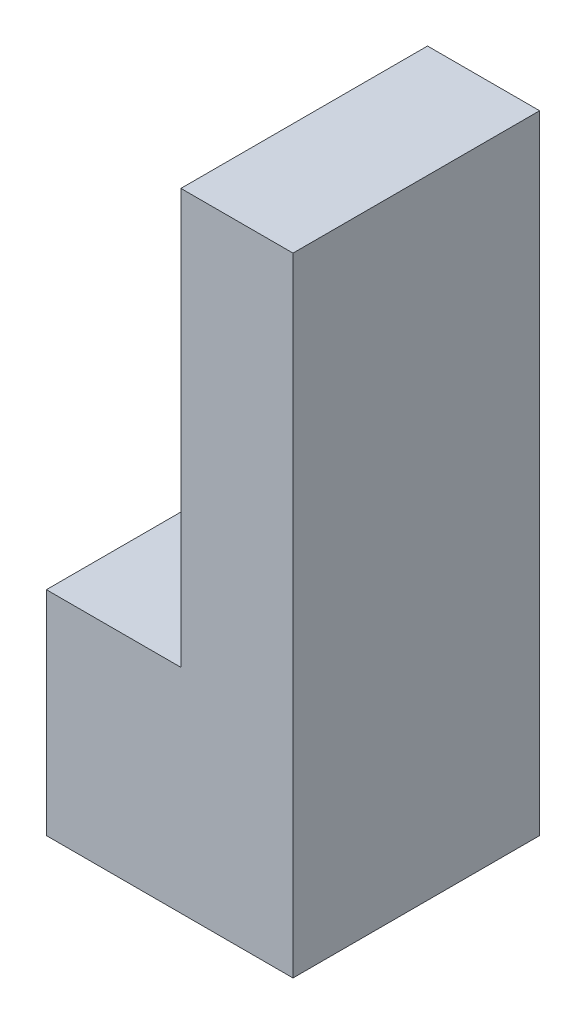
ISO-10303-21;
HEADER;
FILE_DESCRIPTION(('STEP AP214'),'2;1');
FILE_NAME('part.step','',(''),(''),'','','');
FILE_SCHEMA(('AUTOMOTIVE_DESIGN { 1 0 10303 214 1 1 1 1 }'));
ENDSEC;
DATA;
#1=APPLICATION_CONTEXT('core data for automotive mechanical design processes');
#2=APPLICATION_PROTOCOL_DEFINITION('international standard','automotive_design',2000,#1);
#3=PRODUCT_CONTEXT('',#1,'mechanical');
#4=PRODUCT('Part','Part','',(#3));
#5=PRODUCT_RELATED_PRODUCT_CATEGORY('part','',(#4));
#6=PRODUCT_DEFINITION_FORMATION('','',#4);
#7=PRODUCT_DEFINITION_CONTEXT('part definition',#1,'design');
#8=PRODUCT_DEFINITION('design','',#6,#7);
#9=PRODUCT_DEFINITION_SHAPE('','',#8);
#10=(LENGTH_UNIT() NAMED_UNIT(*) SI_UNIT(.MILLI.,.METRE.));
#11=(NAMED_UNIT(*) PLANE_ANGLE_UNIT() SI_UNIT($,.RADIAN.));
#12=(NAMED_UNIT(*) SI_UNIT($,.STERADIAN.) SOLID_ANGLE_UNIT());
#13=UNCERTAINTY_MEASURE_WITH_UNIT(LENGTH_MEASURE(1.E-05),#10,'distance_accuracy_value','');
#14=(GEOMETRIC_REPRESENTATION_CONTEXT(3) GLOBAL_UNCERTAINTY_ASSIGNED_CONTEXT((#13)) GLOBAL_UNIT_ASSIGNED_CONTEXT((#10,
#11,#12)) REPRESENTATION_CONTEXT('',''));
#15=CARTESIAN_POINT('',(0.,0.,0.));
#16=DIRECTION('',(0.,0.,1.));
#17=DIRECTION('',(1.,0.,0.));
#18=AXIS2_PLACEMENT_3D('',#15,#16,#17);
#19=CARTESIAN_POINT('',(-371.957289172653,355.6,-434.622222222222));
#20=DIRECTION('',(1.,0.,0.));
#21=DIRECTION('',(0.,0.,-1.));
#22=AXIS2_PLACEMENT_3D('',#19,#20,#21);
#23=PLANE('',#22);
#24=DIRECTION('',(0.,0.,1.));
#25=VECTOR('',#24,1.);
#26=CARTESIAN_POINT('',(-371.957289172653,120.65,-434.622222222222));
#27=LINE('',#26,#25);
#28=CARTESIAN_POINT('',(-371.957289172653,120.65,-434.622222222222));
#29=VERTEX_POINT('',#28);
#30=CARTESIAN_POINT('',(-371.957289172653,120.65,-294.922222222222));
#31=VERTEX_POINT('',#30);
#32=EDGE_CURVE('E80',#29,#31,#27,.T.);
#33=ORIENTED_EDGE('',*,*,#32,.F.);
#34=DIRECTION('',(0.,-1.,0.));
#35=VECTOR('',#34,1.);
#36=CARTESIAN_POINT('',(-371.957289172653,355.6,-434.622222222222));
#37=LINE('',#36,#35);
#38=CARTESIAN_POINT('',(-371.957289172653,0.,-434.622222222222));
#39=VERTEX_POINT('',#38);
#40=EDGE_CURVE('E74',#29,#39,#37,.T.);
#41=ORIENTED_EDGE('',*,*,#40,.T.);
#42=DIRECTION('',(0.,0.,1.));
#43=VECTOR('',#42,1.);
#44=CARTESIAN_POINT('',(-371.957289172653,0.,-434.622222222222));
#45=LINE('',#44,#43);
#46=CARTESIAN_POINT('',(-371.957289172653,0.,-294.922222222222));
#47=VERTEX_POINT('',#46);
#48=EDGE_CURVE('E78',#39,#47,#45,.T.);
#49=ORIENTED_EDGE('',*,*,#48,.T.);
#50=DIRECTION('',(0.,-1.,0.));
#51=VECTOR('',#50,1.);
#52=CARTESIAN_POINT('',(-371.957289172653,355.6,-294.922222222222));
#53=LINE('',#52,#51);
#54=EDGE_CURVE('E11',#31,#47,#53,.T.);
#55=ORIENTED_EDGE('',*,*,#54,.F.);
#56=EDGE_LOOP('',(#33,#41,#49,#55));
#57=FACE_BOUND('',#56,.T.);
#58=ADVANCED_FACE('F32',(#57),#23,.F.);
#59=CARTESIAN_POINT('',(-371.957289172653,355.6,-294.922222222222));
#60=DIRECTION('',(0.,0.,-1.));
#61=DIRECTION('',(-1.,0.,0.));
#62=AXIS2_PLACEMENT_3D('',#59,#60,#61);
#63=PLANE('',#62);
#64=DIRECTION('',(1.,0.,0.));
#65=VECTOR('',#64,1.);
#66=CARTESIAN_POINT('',(-371.957289172653,355.6,-294.922222222222));
#67=LINE('',#66,#65);
#68=CARTESIAN_POINT('',(-295.757289172653,355.6,-294.922222222222));
#69=VERTEX_POINT('',#68);
#70=CARTESIAN_POINT('',(-232.257289172653,355.6,-294.922222222222));
#71=VERTEX_POINT('',#70);
#72=EDGE_CURVE('E93',#69,#71,#67,.T.);
#73=ORIENTED_EDGE('',*,*,#72,.F.);
#74=DIRECTION('',(0.,1.,0.));
#75=VECTOR('',#74,1.);
#76=CARTESIAN_POINT('',(-295.757289172653,120.65,-294.922222222222));
#77=LINE('',#76,#75);
#78=CARTESIAN_POINT('',(-295.757289172653,120.65,-294.922222222222));
#79=VERTEX_POINT('',#78);
#80=EDGE_CURVE('E46',#79,#69,#77,.T.);
#81=ORIENTED_EDGE('',*,*,#80,.F.);
#82=DIRECTION('',(1.,0.,0.));
#83=VECTOR('',#82,1.);
#84=CARTESIAN_POINT('',(-371.957289172653,120.65,-294.922222222222));
#85=LINE('',#84,#83);
#86=EDGE_CURVE('E118',#31,#79,#85,.T.);
#87=ORIENTED_EDGE('',*,*,#86,.F.);
#88=ORIENTED_EDGE('',*,*,#54,.T.);
#89=DIRECTION('',(1.,0.,0.));
#90=VECTOR('',#89,1.);
#91=CARTESIAN_POINT('',(-371.957289172653,0.,-294.922222222222));
#92=LINE('',#91,#90);
#93=CARTESIAN_POINT('',(-232.257289172653,0.,-294.922222222222));
#94=VERTEX_POINT('',#93);
#95=EDGE_CURVE('E98',#47,#94,#92,.T.);
#96=ORIENTED_EDGE('',*,*,#95,.T.);
#97=DIRECTION('',(0.,-1.,0.));
#98=VECTOR('',#97,1.);
#99=CARTESIAN_POINT('',(-232.257289172653,355.6,-294.922222222222));
#100=LINE('',#99,#98);
#101=EDGE_CURVE('E39',#71,#94,#100,.T.);
#102=ORIENTED_EDGE('',*,*,#101,.F.);
#103=EDGE_LOOP('',(#73,#81,#87,#88,#96,#102));
#104=FACE_BOUND('',#103,.T.);
#105=ADVANCED_FACE('F114',(#104),#63,.F.);
#106=CARTESIAN_POINT('',(-232.257289172653,355.6,-434.622222222222));
#107=DIRECTION('',(-1.,0.,0.));
#108=DIRECTION('',(0.,0.,1.));
#109=AXIS2_PLACEMENT_3D('',#106,#107,#108);
#110=PLANE('',#109);
#111=DIRECTION('',(0.,0.,-1.));
#112=VECTOR('',#111,1.);
#113=CARTESIAN_POINT('',(-232.257289172653,0.,-434.622222222222));
#114=LINE('',#113,#112);
#115=CARTESIAN_POINT('',(-232.257289172653,0.,-434.622222222222));
#116=VERTEX_POINT('',#115);
#117=EDGE_CURVE('E94',#94,#116,#114,.T.);
#118=ORIENTED_EDGE('',*,*,#117,.T.);
#119=DIRECTION('',(0.,-1.,0.));
#120=VECTOR('',#119,1.);
#121=CARTESIAN_POINT('',(-232.257289172653,355.6,-434.622222222222));
#122=LINE('',#121,#120);
#123=CARTESIAN_POINT('',(-232.257289172653,355.6,-434.622222222222));
#124=VERTEX_POINT('',#123);
#125=EDGE_CURVE('E83',#124,#116,#122,.T.);
#126=ORIENTED_EDGE('',*,*,#125,.F.);
#127=DIRECTION('',(0.,0.,-1.));
#128=VECTOR('',#127,1.);
#129=CARTESIAN_POINT('',(-232.257289172653,355.6,-434.622222222222));
#130=LINE('',#129,#128);
#131=EDGE_CURVE('E55',#71,#124,#130,.T.);
#132=ORIENTED_EDGE('',*,*,#131,.F.);
#133=ORIENTED_EDGE('',*,*,#101,.T.);
#134=EDGE_LOOP('',(#118,#126,#132,#133));
#135=FACE_BOUND('',#134,.T.);
#136=ADVANCED_FACE('F111',(#135),#110,.F.);
#137=CARTESIAN_POINT('',(-371.957289172653,355.6,-434.622222222222));
#138=DIRECTION('',(0.,0.,1.));
#139=DIRECTION('',(1.,0.,0.));
#140=AXIS2_PLACEMENT_3D('',#137,#138,#139);
#141=PLANE('',#140);
#142=DIRECTION('',(-1.,0.,0.));
#143=VECTOR('',#142,1.);
#144=CARTESIAN_POINT('',(-371.957289172653,120.65,-434.622222222222));
#145=LINE('',#144,#143);
#146=CARTESIAN_POINT('',(-295.757289172653,120.65,-434.622222222222));
#147=VERTEX_POINT('',#146);
#148=EDGE_CURVE('E130',#147,#29,#145,.T.);
#149=ORIENTED_EDGE('',*,*,#148,.F.);
#150=DIRECTION('',(0.,1.,0.));
#151=VECTOR('',#150,1.);
#152=CARTESIAN_POINT('',(-295.757289172653,120.65,-434.622222222222));
#153=LINE('',#152,#151);
#154=CARTESIAN_POINT('',(-295.757289172653,355.6,-434.622222222222));
#155=VERTEX_POINT('',#154);
#156=EDGE_CURVE('E99',#147,#155,#153,.T.);
#157=ORIENTED_EDGE('',*,*,#156,.T.);
#158=DIRECTION('',(-1.,0.,0.));
#159=VECTOR('',#158,1.);
#160=CARTESIAN_POINT('',(-371.957289172653,355.6,-434.622222222222));
#161=LINE('',#160,#159);
#162=EDGE_CURVE('E84',#124,#155,#161,.T.);
#163=ORIENTED_EDGE('',*,*,#162,.F.);
#164=ORIENTED_EDGE('',*,*,#125,.T.);
#165=DIRECTION('',(-1.,0.,0.));
#166=VECTOR('',#165,1.);
#167=CARTESIAN_POINT('',(-371.957289172653,0.,-434.622222222222));
#168=LINE('',#167,#166);
#169=EDGE_CURVE('E88',#116,#39,#168,.T.);
#170=ORIENTED_EDGE('',*,*,#169,.T.);
#171=ORIENTED_EDGE('',*,*,#40,.F.);
#172=EDGE_LOOP('',(#149,#157,#163,#164,#170,#171));
#173=FACE_BOUND('',#172,.T.);
#174=ADVANCED_FACE('F89',(#173),#141,.F.);
#175=CARTESIAN_POINT('',(0.,355.6,0.));
#176=DIRECTION('',(0.,1.,0.));
#177=DIRECTION('',(0.,0.,1.));
#178=AXIS2_PLACEMENT_3D('',#175,#176,#177);
#179=PLANE('',#178);
#180=DIRECTION('',(0.,0.,-1.));
#181=VECTOR('',#180,1.);
#182=CARTESIAN_POINT('',(-295.757289172653,355.6,-434.622222222222));
#183=LINE('',#182,#181);
#184=EDGE_CURVE('E138',#69,#155,#183,.T.);
#185=ORIENTED_EDGE('',*,*,#184,.F.);
#186=ORIENTED_EDGE('',*,*,#72,.T.);
#187=ORIENTED_EDGE('',*,*,#131,.T.);
#188=ORIENTED_EDGE('',*,*,#162,.T.);
#189=EDGE_LOOP('',(#185,#186,#187,#188));
#190=FACE_BOUND('',#189,.T.);
#191=ADVANCED_FACE('F140',(#190),#179,.T.);
#192=CARTESIAN_POINT('',(0.,0.,0.));
#193=DIRECTION('',(0.,1.,0.));
#194=DIRECTION('',(0.,0.,1.));
#195=AXIS2_PLACEMENT_3D('',#192,#193,#194);
#196=PLANE('',#195);
#197=ORIENTED_EDGE('',*,*,#48,.F.);
#198=ORIENTED_EDGE('',*,*,#169,.F.);
#199=ORIENTED_EDGE('',*,*,#117,.F.);
#200=ORIENTED_EDGE('',*,*,#95,.F.);
#201=EDGE_LOOP('',(#197,#198,#199,#200));
#202=FACE_BOUND('',#201,.T.);
#203=ADVANCED_FACE('F97',(#202),#196,.F.);
#204=CARTESIAN_POINT('',(-295.757289172653,120.65,-434.622222222222));
#205=DIRECTION('',(1.,0.,0.));
#206=DIRECTION('',(0.,0.,-1.));
#207=AXIS2_PLACEMENT_3D('',#204,#205,#206);
#208=PLANE('',#207);
#209=ORIENTED_EDGE('',*,*,#184,.T.);
#210=ORIENTED_EDGE('',*,*,#156,.F.);
#211=DIRECTION('',(0.,0.,-1.));
#212=VECTOR('',#211,1.);
#213=CARTESIAN_POINT('',(-295.757289172653,120.65,-434.622222222222));
#214=LINE('',#213,#212);
#215=EDGE_CURVE('E132',#79,#147,#214,.T.);
#216=ORIENTED_EDGE('',*,*,#215,.F.);
#217=ORIENTED_EDGE('',*,*,#80,.T.);
#218=EDGE_LOOP('',(#209,#210,#216,#217));
#219=FACE_BOUND('',#218,.T.);
#220=ADVANCED_FACE('F141',(#219),#208,.F.);
#221=CARTESIAN_POINT('',(0.,120.65,0.));
#222=DIRECTION('',(0.,1.,0.));
#223=DIRECTION('',(0.,0.,1.));
#224=AXIS2_PLACEMENT_3D('',#221,#222,#223);
#225=PLANE('',#224);
#226=ORIENTED_EDGE('',*,*,#32,.T.);
#227=ORIENTED_EDGE('',*,*,#86,.T.);
#228=ORIENTED_EDGE('',*,*,#215,.T.);
#229=ORIENTED_EDGE('',*,*,#148,.T.);
#230=EDGE_LOOP('',(#226,#227,#228,#229));
#231=FACE_BOUND('',#230,.T.);
#232=ADVANCED_FACE('F131',(#231),#225,.T.);
#233=CLOSED_SHELL('',(#58,#105,#136,#174,#191,#203,#220,#232));
#234=MANIFOLD_SOLID_BREP('B2',#233);
#235=ADVANCED_BREP_SHAPE_REPRESENTATION('',(#18,#234),#14);
#236=SHAPE_DEFINITION_REPRESENTATION(#9,#235);
ENDSEC;
END-ISO-10303-21;
